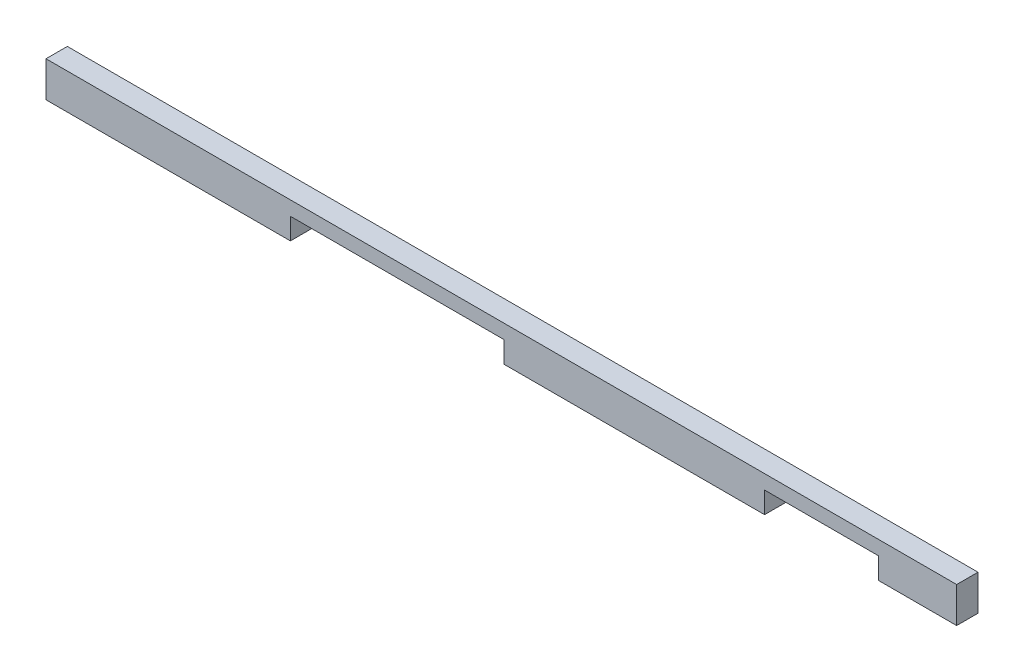
ISO-10303-21;
HEADER;
FILE_DESCRIPTION(('STEP AP214'),'2;1');
FILE_NAME('part.step','',(''),(''),'','','');
FILE_SCHEMA(('AUTOMOTIVE_DESIGN { 1 0 10303 214 1 1 1 1 }'));
ENDSEC;
DATA;
#1=APPLICATION_CONTEXT('core data for automotive mechanical design processes');
#2=APPLICATION_PROTOCOL_DEFINITION('international standard','automotive_design',2000,#1);
#3=PRODUCT_CONTEXT('',#1,'mechanical');
#4=PRODUCT('Part','Part','',(#3));
#5=PRODUCT_RELATED_PRODUCT_CATEGORY('part','',(#4));
#6=PRODUCT_DEFINITION_FORMATION('','',#4);
#7=PRODUCT_DEFINITION_CONTEXT('part definition',#1,'design');
#8=PRODUCT_DEFINITION('design','',#6,#7);
#9=PRODUCT_DEFINITION_SHAPE('','',#8);
#10=(LENGTH_UNIT() NAMED_UNIT(*) SI_UNIT(.MILLI.,.METRE.));
#11=(NAMED_UNIT(*) PLANE_ANGLE_UNIT() SI_UNIT($,.RADIAN.));
#12=(NAMED_UNIT(*) SI_UNIT($,.STERADIAN.) SOLID_ANGLE_UNIT());
#13=UNCERTAINTY_MEASURE_WITH_UNIT(LENGTH_MEASURE(1.E-05),#10,'distance_accuracy_value','');
#14=(GEOMETRIC_REPRESENTATION_CONTEXT(3) GLOBAL_UNCERTAINTY_ASSIGNED_CONTEXT((#13)) GLOBAL_UNIT_ASSIGNED_CONTEXT((#10,
#11,#12)) REPRESENTATION_CONTEXT('',''));
#15=CARTESIAN_POINT('',(0.,0.,0.));
#16=DIRECTION('',(0.,0.,1.));
#17=DIRECTION('',(1.,0.,0.));
#18=AXIS2_PLACEMENT_3D('',#15,#16,#17);
#19=CARTESIAN_POINT('',(0.,0.,0.));
#20=DIRECTION('',(0.,-1.,0.));
#21=DIRECTION('',(0.,0.,-1.));
#22=AXIS2_PLACEMENT_3D('',#19,#20,#21);
#23=PLANE('',#22);
#24=DIRECTION('',(0.,0.,-1.));
#25=VECTOR('',#24,1.);
#26=CARTESIAN_POINT('',(336.55,0.,9.525));
#27=LINE('',#26,#25);
#28=CARTESIAN_POINT('',(336.55,0.,9.525));
#29=VERTEX_POINT('',#28);
#30=CARTESIAN_POINT('',(336.55,0.,-9.525));
#31=VERTEX_POINT('',#30);
#32=EDGE_CURVE('E124',#29,#31,#27,.T.);
#33=ORIENTED_EDGE('',*,*,#32,.T.);
#34=DIRECTION('',(-1.,0.,0.));
#35=VECTOR('',#34,1.);
#36=CARTESIAN_POINT('',(-406.4,0.,-9.525));
#37=LINE('',#36,#35);
#38=CARTESIAN_POINT('',(406.4,0.,-9.525));
#39=VERTEX_POINT('',#38);
#40=EDGE_CURVE('E153',#39,#31,#37,.T.);
#41=ORIENTED_EDGE('',*,*,#40,.F.);
#42=DIRECTION('',(0.,0.,-1.));
#43=VECTOR('',#42,1.);
#44=CARTESIAN_POINT('',(406.4,0.,9.525));
#45=LINE('',#44,#43);
#46=CARTESIAN_POINT('',(406.4,0.,9.525));
#47=VERTEX_POINT('',#46);
#48=EDGE_CURVE('E147',#47,#39,#45,.T.);
#49=ORIENTED_EDGE('',*,*,#48,.F.);
#50=DIRECTION('',(1.,0.,0.));
#51=VECTOR('',#50,1.);
#52=CARTESIAN_POINT('',(-406.4,0.,9.525));
#53=LINE('',#52,#51);
#54=EDGE_CURVE('E140',#29,#47,#53,.T.);
#55=ORIENTED_EDGE('',*,*,#54,.F.);
#56=EDGE_LOOP('',(#33,#41,#49,#55));
#57=FACE_BOUND('',#56,.T.);
#58=ADVANCED_FACE('F35',(#57),#23,.T.);
#59=DIRECTION('',(0.,0.,-1.));
#60=VECTOR('',#59,1.);
#61=CARTESIAN_POINT('',(234.95,0.,9.525));
#62=LINE('',#61,#60);
#63=CARTESIAN_POINT('',(234.95,0.,9.525));
#64=VERTEX_POINT('',#63);
#65=CARTESIAN_POINT('',(234.95,0.,-9.525));
#66=VERTEX_POINT('',#65);
#67=EDGE_CURVE('E134',#64,#66,#62,.T.);
#68=ORIENTED_EDGE('',*,*,#67,.F.);
#69=CARTESIAN_POINT('',(2.23550652740234,0.,9.525));
#70=VERTEX_POINT('',#69);
#71=EDGE_CURVE('E148',#70,#64,#53,.T.);
#72=ORIENTED_EDGE('',*,*,#71,.F.);
#73=DIRECTION('',(0.,0.,-1.));
#74=VECTOR('',#73,1.);
#75=CARTESIAN_POINT('',(2.23550652740234,0.,9.525));
#76=LINE('',#75,#74);
#77=CARTESIAN_POINT('',(2.23550652740234,0.,-9.525));
#78=VERTEX_POINT('',#77);
#79=EDGE_CURVE('E169',#70,#78,#76,.T.);
#80=ORIENTED_EDGE('',*,*,#79,.T.);
#81=EDGE_CURVE('E179',#66,#78,#37,.T.);
#82=ORIENTED_EDGE('',*,*,#81,.F.);
#83=EDGE_LOOP('',(#68,#72,#80,#82));
#84=FACE_BOUND('',#83,.T.);
#85=ADVANCED_FACE('F232',(#84),#23,.T.);
#86=CARTESIAN_POINT('',(406.4,31.75,9.525));
#87=DIRECTION('',(-1.,0.,0.));
#88=DIRECTION('',(0.,0.,1.));
#89=AXIS2_PLACEMENT_3D('',#86,#87,#88);
#90=PLANE('',#89);
#91=ORIENTED_EDGE('',*,*,#48,.T.);
#92=DIRECTION('',(0.,-1.,0.));
#93=VECTOR('',#92,1.);
#94=CARTESIAN_POINT('',(406.4,31.75,-9.525));
#95=LINE('',#94,#93);
#96=CARTESIAN_POINT('',(406.4,31.75,-9.525));
#97=VERTEX_POINT('',#96);
#98=EDGE_CURVE('E11',#97,#39,#95,.T.);
#99=ORIENTED_EDGE('',*,*,#98,.F.);
#100=DIRECTION('',(0.,0.,-1.));
#101=VECTOR('',#100,1.);
#102=CARTESIAN_POINT('',(406.4,31.75,9.525));
#103=LINE('',#102,#101);
#104=CARTESIAN_POINT('',(406.4,31.75,9.525));
#105=VERTEX_POINT('',#104);
#106=EDGE_CURVE('E157',#105,#97,#103,.T.);
#107=ORIENTED_EDGE('',*,*,#106,.F.);
#108=DIRECTION('',(0.,-1.,0.));
#109=VECTOR('',#108,1.);
#110=CARTESIAN_POINT('',(406.4,31.75,9.525));
#111=LINE('',#110,#109);
#112=EDGE_CURVE('E175',#105,#47,#111,.T.);
#113=ORIENTED_EDGE('',*,*,#112,.T.);
#114=EDGE_LOOP('',(#91,#99,#107,#113));
#115=FACE_BOUND('',#114,.T.);
#116=ADVANCED_FACE('F37',(#115),#90,.F.);
#117=CARTESIAN_POINT('',(-406.4,31.75,-9.525));
#118=DIRECTION('',(0.,0.,1.));
#119=DIRECTION('',(1.,0.,0.));
#120=AXIS2_PLACEMENT_3D('',#117,#118,#119);
#121=PLANE('',#120);
#122=ORIENTED_EDGE('',*,*,#40,.T.);
#123=DIRECTION('',(0.,-1.,0.));
#124=VECTOR('',#123,1.);
#125=CARTESIAN_POINT('',(336.55,19.05,-9.525));
#126=LINE('',#125,#124);
#127=CARTESIAN_POINT('',(336.55,19.05,-9.525));
#128=VERTEX_POINT('',#127);
#129=EDGE_CURVE('E130',#128,#31,#126,.T.);
#130=ORIENTED_EDGE('',*,*,#129,.F.);
#131=DIRECTION('',(1.,0.,0.));
#132=VECTOR('',#131,1.);
#133=CARTESIAN_POINT('',(234.95,19.05,-9.525));
#134=LINE('',#133,#132);
#135=CARTESIAN_POINT('',(234.95,19.05,-9.525));
#136=VERTEX_POINT('',#135);
#137=EDGE_CURVE('E143',#136,#128,#134,.T.);
#138=ORIENTED_EDGE('',*,*,#137,.F.);
#139=DIRECTION('',(0.,1.,0.));
#140=VECTOR('',#139,1.);
#141=CARTESIAN_POINT('',(234.95,0.,-9.525));
#142=LINE('',#141,#140);
#143=EDGE_CURVE('E224',#66,#136,#142,.T.);
#144=ORIENTED_EDGE('',*,*,#143,.F.);
#145=ORIENTED_EDGE('',*,*,#81,.T.);
#146=DIRECTION('',(0.,-1.,0.));
#147=VECTOR('',#146,1.);
#148=CARTESIAN_POINT('',(2.23550652740234,19.05,-9.525));
#149=LINE('',#148,#147);
#150=CARTESIAN_POINT('',(2.23550652740234,19.05,-9.525));
#151=VERTEX_POINT('',#150);
#152=EDGE_CURVE('E211',#151,#78,#149,.T.);
#153=ORIENTED_EDGE('',*,*,#152,.F.);
#154=DIRECTION('',(1.,0.,0.));
#155=VECTOR('',#154,1.);
#156=CARTESIAN_POINT('',(-188.264493472598,19.05,-9.525));
#157=LINE('',#156,#155);
#158=CARTESIAN_POINT('',(-188.264493472598,19.05,-9.525));
#159=VERTEX_POINT('',#158);
#160=EDGE_CURVE('E206',#159,#151,#157,.T.);
#161=ORIENTED_EDGE('',*,*,#160,.F.);
#162=DIRECTION('',(0.,1.,0.));
#163=VECTOR('',#162,1.);
#164=CARTESIAN_POINT('',(-188.264493472598,0.,-9.525));
#165=LINE('',#164,#163);
#166=CARTESIAN_POINT('',(-188.264493472598,0.,-9.525));
#167=VERTEX_POINT('',#166);
#168=EDGE_CURVE('E190',#167,#159,#165,.T.);
#169=ORIENTED_EDGE('',*,*,#168,.F.);
#170=CARTESIAN_POINT('',(-406.4,0.,-9.525));
#171=VERTEX_POINT('',#170);
#172=EDGE_CURVE('E177',#167,#171,#37,.T.);
#173=ORIENTED_EDGE('',*,*,#172,.T.);
#174=DIRECTION('',(0.,-1.,0.));
#175=VECTOR('',#174,1.);
#176=CARTESIAN_POINT('',(-406.4,31.75,-9.525));
#177=LINE('',#176,#175);
#178=CARTESIAN_POINT('',(-406.4,31.75,-9.525));
#179=VERTEX_POINT('',#178);
#180=EDGE_CURVE('E43',#179,#171,#177,.T.);
#181=ORIENTED_EDGE('',*,*,#180,.F.);
#182=DIRECTION('',(-1.,0.,0.));
#183=VECTOR('',#182,1.);
#184=CARTESIAN_POINT('',(-406.4,31.75,-9.525));
#185=LINE('',#184,#183);
#186=EDGE_CURVE('E161',#97,#179,#185,.T.);
#187=ORIENTED_EDGE('',*,*,#186,.F.);
#188=ORIENTED_EDGE('',*,*,#98,.T.);
#189=EDGE_LOOP('',(#122,#130,#138,#144,#145,#153,#161,#169,#173,#181,#187,#188));
#190=FACE_BOUND('',#189,.T.);
#191=ADVANCED_FACE('F186',(#190),#121,.F.);
#192=CARTESIAN_POINT('',(-406.4,31.75,9.525));
#193=DIRECTION('',(1.,0.,0.));
#194=DIRECTION('',(0.,0.,-1.));
#195=AXIS2_PLACEMENT_3D('',#192,#193,#194);
#196=PLANE('',#195);
#197=DIRECTION('',(0.,0.,1.));
#198=VECTOR('',#197,1.);
#199=CARTESIAN_POINT('',(-406.4,0.,9.525));
#200=LINE('',#199,#198);
#201=CARTESIAN_POINT('',(-406.4,0.,9.525));
#202=VERTEX_POINT('',#201);
#203=EDGE_CURVE('E149',#171,#202,#200,.T.);
#204=ORIENTED_EDGE('',*,*,#203,.T.);
#205=DIRECTION('',(0.,-1.,0.));
#206=VECTOR('',#205,1.);
#207=CARTESIAN_POINT('',(-406.4,31.75,9.525));
#208=LINE('',#207,#206);
#209=CARTESIAN_POINT('',(-406.4,31.75,9.525));
#210=VERTEX_POINT('',#209);
#211=EDGE_CURVE('E196',#210,#202,#208,.T.);
#212=ORIENTED_EDGE('',*,*,#211,.F.);
#213=DIRECTION('',(0.,0.,1.));
#214=VECTOR('',#213,1.);
#215=CARTESIAN_POINT('',(-406.4,31.75,9.525));
#216=LINE('',#215,#214);
#217=EDGE_CURVE('E166',#179,#210,#216,.T.);
#218=ORIENTED_EDGE('',*,*,#217,.F.);
#219=ORIENTED_EDGE('',*,*,#180,.T.);
#220=EDGE_LOOP('',(#204,#212,#218,#219));
#221=FACE_BOUND('',#220,.T.);
#222=ADVANCED_FACE('F194',(#221),#196,.F.);
#223=CARTESIAN_POINT('',(-406.4,31.75,9.525));
#224=DIRECTION('',(0.,0.,-1.));
#225=DIRECTION('',(-1.,0.,0.));
#226=AXIS2_PLACEMENT_3D('',#223,#224,#225);
#227=PLANE('',#226);
#228=DIRECTION('',(1.,0.,0.));
#229=VECTOR('',#228,1.);
#230=CARTESIAN_POINT('',(234.95,19.05,9.525));
#231=LINE('',#230,#229);
#232=CARTESIAN_POINT('',(234.95,19.05,9.525));
#233=VERTEX_POINT('',#232);
#234=CARTESIAN_POINT('',(336.55,19.05,9.525));
#235=VERTEX_POINT('',#234);
#236=EDGE_CURVE('E135',#233,#235,#231,.T.);
#237=ORIENTED_EDGE('',*,*,#236,.T.);
#238=DIRECTION('',(0.,-1.,0.));
#239=VECTOR('',#238,1.);
#240=CARTESIAN_POINT('',(336.55,19.05,9.525));
#241=LINE('',#240,#239);
#242=EDGE_CURVE('E127',#235,#29,#241,.T.);
#243=ORIENTED_EDGE('',*,*,#242,.T.);
#244=ORIENTED_EDGE('',*,*,#54,.T.);
#245=ORIENTED_EDGE('',*,*,#112,.F.);
#246=DIRECTION('',(1.,0.,0.));
#247=VECTOR('',#246,1.);
#248=CARTESIAN_POINT('',(-406.4,31.75,9.525));
#249=LINE('',#248,#247);
#250=EDGE_CURVE('E173',#210,#105,#249,.T.);
#251=ORIENTED_EDGE('',*,*,#250,.F.);
#252=ORIENTED_EDGE('',*,*,#211,.T.);
#253=CARTESIAN_POINT('',(-188.264493472598,0.,9.525));
#254=VERTEX_POINT('',#253);
#255=EDGE_CURVE('E151',#202,#254,#53,.T.);
#256=ORIENTED_EDGE('',*,*,#255,.T.);
#257=DIRECTION('',(0.,1.,0.));
#258=VECTOR('',#257,1.);
#259=CARTESIAN_POINT('',(-188.264493472598,0.,9.525));
#260=LINE('',#259,#258);
#261=CARTESIAN_POINT('',(-188.264493472598,19.05,9.525));
#262=VERTEX_POINT('',#261);
#263=EDGE_CURVE('E58',#254,#262,#260,.T.);
#264=ORIENTED_EDGE('',*,*,#263,.T.);
#265=DIRECTION('',(1.,0.,0.));
#266=VECTOR('',#265,1.);
#267=CARTESIAN_POINT('',(-188.264493472598,19.05,9.525));
#268=LINE('',#267,#266);
#269=CARTESIAN_POINT('',(2.23550652740234,19.05,9.525));
#270=VERTEX_POINT('',#269);
#271=EDGE_CURVE('E203',#262,#270,#268,.T.);
#272=ORIENTED_EDGE('',*,*,#271,.T.);
#273=DIRECTION('',(0.,-1.,0.));
#274=VECTOR('',#273,1.);
#275=CARTESIAN_POINT('',(2.23550652740234,19.05,9.525));
#276=LINE('',#275,#274);
#277=EDGE_CURVE('E209',#270,#70,#276,.T.);
#278=ORIENTED_EDGE('',*,*,#277,.T.);
#279=ORIENTED_EDGE('',*,*,#71,.T.);
#280=DIRECTION('',(0.,1.,0.));
#281=VECTOR('',#280,1.);
#282=CARTESIAN_POINT('',(234.95,0.,9.525));
#283=LINE('',#282,#281);
#284=EDGE_CURVE('E50',#64,#233,#283,.T.);
#285=ORIENTED_EDGE('',*,*,#284,.T.);
#286=EDGE_LOOP('',(#237,#243,#244,#245,#251,#252,#256,#264,#272,#278,#279,#285));
#287=FACE_BOUND('',#286,.T.);
#288=ADVANCED_FACE('F138',(#287),#227,.F.);
#289=CARTESIAN_POINT('',(0.,31.75,0.));
#290=DIRECTION('',(0.,-1.,0.));
#291=DIRECTION('',(0.,0.,-1.));
#292=AXIS2_PLACEMENT_3D('',#289,#290,#291);
#293=PLANE('',#292);
#294=ORIENTED_EDGE('',*,*,#106,.T.);
#295=ORIENTED_EDGE('',*,*,#186,.T.);
#296=ORIENTED_EDGE('',*,*,#217,.T.);
#297=ORIENTED_EDGE('',*,*,#250,.T.);
#298=EDGE_LOOP('',(#294,#295,#296,#297));
#299=FACE_BOUND('',#298,.T.);
#300=ADVANCED_FACE('F258',(#299),#293,.F.);
#301=DIRECTION('',(0.,0.,-1.));
#302=VECTOR('',#301,1.);
#303=CARTESIAN_POINT('',(-188.264493472598,0.,9.525));
#304=LINE('',#303,#302);
#305=EDGE_CURVE('E198',#254,#167,#304,.T.);
#306=ORIENTED_EDGE('',*,*,#305,.F.);
#307=ORIENTED_EDGE('',*,*,#255,.F.);
#308=ORIENTED_EDGE('',*,*,#203,.F.);
#309=ORIENTED_EDGE('',*,*,#172,.F.);
#310=EDGE_LOOP('',(#306,#307,#308,#309));
#311=FACE_BOUND('',#310,.T.);
#312=ADVANCED_FACE('F197',(#311),#23,.T.);
#313=CARTESIAN_POINT('',(2.23550652740234,19.05,9.525));
#314=DIRECTION('',(1.,0.,0.));
#315=DIRECTION('',(0.,0.,-1.));
#316=AXIS2_PLACEMENT_3D('',#313,#314,#315);
#317=PLANE('',#316);
#318=ORIENTED_EDGE('',*,*,#152,.T.);
#319=ORIENTED_EDGE('',*,*,#79,.F.);
#320=ORIENTED_EDGE('',*,*,#277,.F.);
#321=DIRECTION('',(0.,0.,-1.));
#322=VECTOR('',#321,1.);
#323=CARTESIAN_POINT('',(2.23550652740234,19.05,9.525));
#324=LINE('',#323,#322);
#325=EDGE_CURVE('E200',#270,#151,#324,.T.);
#326=ORIENTED_EDGE('',*,*,#325,.T.);
#327=EDGE_LOOP('',(#318,#319,#320,#326));
#328=FACE_BOUND('',#327,.T.);
#329=ADVANCED_FACE('F257',(#328),#317,.F.);
#330=CARTESIAN_POINT('',(-188.264493472598,19.05,9.525));
#331=DIRECTION('',(0.,1.,0.));
#332=DIRECTION('',(0.,0.,1.));
#333=AXIS2_PLACEMENT_3D('',#330,#331,#332);
#334=PLANE('',#333);
#335=ORIENTED_EDGE('',*,*,#160,.T.);
#336=ORIENTED_EDGE('',*,*,#325,.F.);
#337=ORIENTED_EDGE('',*,*,#271,.F.);
#338=DIRECTION('',(0.,0.,-1.));
#339=VECTOR('',#338,1.);
#340=CARTESIAN_POINT('',(-188.264493472598,19.05,9.525));
#341=LINE('',#340,#339);
#342=EDGE_CURVE('E199',#262,#159,#341,.T.);
#343=ORIENTED_EDGE('',*,*,#342,.T.);
#344=EDGE_LOOP('',(#335,#336,#337,#343));
#345=FACE_BOUND('',#344,.T.);
#346=ADVANCED_FACE('F263',(#345),#334,.F.);
#347=CARTESIAN_POINT('',(-188.264493472598,0.,9.525));
#348=DIRECTION('',(-1.,0.,0.));
#349=DIRECTION('',(0.,0.,1.));
#350=AXIS2_PLACEMENT_3D('',#347,#348,#349);
#351=PLANE('',#350);
#352=ORIENTED_EDGE('',*,*,#168,.T.);
#353=ORIENTED_EDGE('',*,*,#342,.F.);
#354=ORIENTED_EDGE('',*,*,#263,.F.);
#355=ORIENTED_EDGE('',*,*,#305,.T.);
#356=EDGE_LOOP('',(#352,#353,#354,#355));
#357=FACE_BOUND('',#356,.T.);
#358=ADVANCED_FACE('F247',(#357),#351,.F.);
#359=CARTESIAN_POINT('',(336.55,19.05,9.525));
#360=DIRECTION('',(1.,0.,0.));
#361=DIRECTION('',(0.,0.,-1.));
#362=AXIS2_PLACEMENT_3D('',#359,#360,#361);
#363=PLANE('',#362);
#364=ORIENTED_EDGE('',*,*,#129,.T.);
#365=ORIENTED_EDGE('',*,*,#32,.F.);
#366=ORIENTED_EDGE('',*,*,#242,.F.);
#367=DIRECTION('',(0.,0.,-1.));
#368=VECTOR('',#367,1.);
#369=CARTESIAN_POINT('',(336.55,19.05,9.525));
#370=LINE('',#369,#368);
#371=EDGE_CURVE('E178',#235,#128,#370,.T.);
#372=ORIENTED_EDGE('',*,*,#371,.T.);
#373=EDGE_LOOP('',(#364,#365,#366,#372));
#374=FACE_BOUND('',#373,.T.);
#375=ADVANCED_FACE('F126',(#374),#363,.F.);
#376=CARTESIAN_POINT('',(234.95,19.05,9.525));
#377=DIRECTION('',(0.,1.,0.));
#378=DIRECTION('',(0.,0.,1.));
#379=AXIS2_PLACEMENT_3D('',#376,#377,#378);
#380=PLANE('',#379);
#381=ORIENTED_EDGE('',*,*,#137,.T.);
#382=ORIENTED_EDGE('',*,*,#371,.F.);
#383=ORIENTED_EDGE('',*,*,#236,.F.);
#384=DIRECTION('',(0.,0.,-1.));
#385=VECTOR('',#384,1.);
#386=CARTESIAN_POINT('',(234.95,19.05,9.525));
#387=LINE('',#386,#385);
#388=EDGE_CURVE('E219',#233,#136,#387,.T.);
#389=ORIENTED_EDGE('',*,*,#388,.T.);
#390=EDGE_LOOP('',(#381,#382,#383,#389));
#391=FACE_BOUND('',#390,.T.);
#392=ADVANCED_FACE('F239',(#391),#380,.F.);
#393=CARTESIAN_POINT('',(234.95,0.,9.525));
#394=DIRECTION('',(-1.,0.,0.));
#395=DIRECTION('',(0.,0.,1.));
#396=AXIS2_PLACEMENT_3D('',#393,#394,#395);
#397=PLANE('',#396);
#398=ORIENTED_EDGE('',*,*,#143,.T.);
#399=ORIENTED_EDGE('',*,*,#388,.F.);
#400=ORIENTED_EDGE('',*,*,#284,.F.);
#401=ORIENTED_EDGE('',*,*,#67,.T.);
#402=EDGE_LOOP('',(#398,#399,#400,#401));
#403=FACE_BOUND('',#402,.T.);
#404=ADVANCED_FACE('F235',(#403),#397,.F.);
#405=CLOSED_SHELL('',(#58,#85,#116,#191,#222,#288,#300,#312,#329,#346,#358,#375,#392,#404));
#406=MANIFOLD_SOLID_BREP('B2',#405);
#407=ADVANCED_BREP_SHAPE_REPRESENTATION('',(#18,#406),#14);
#408=SHAPE_DEFINITION_REPRESENTATION(#9,#407);
ENDSEC;
END-ISO-10303-21;
